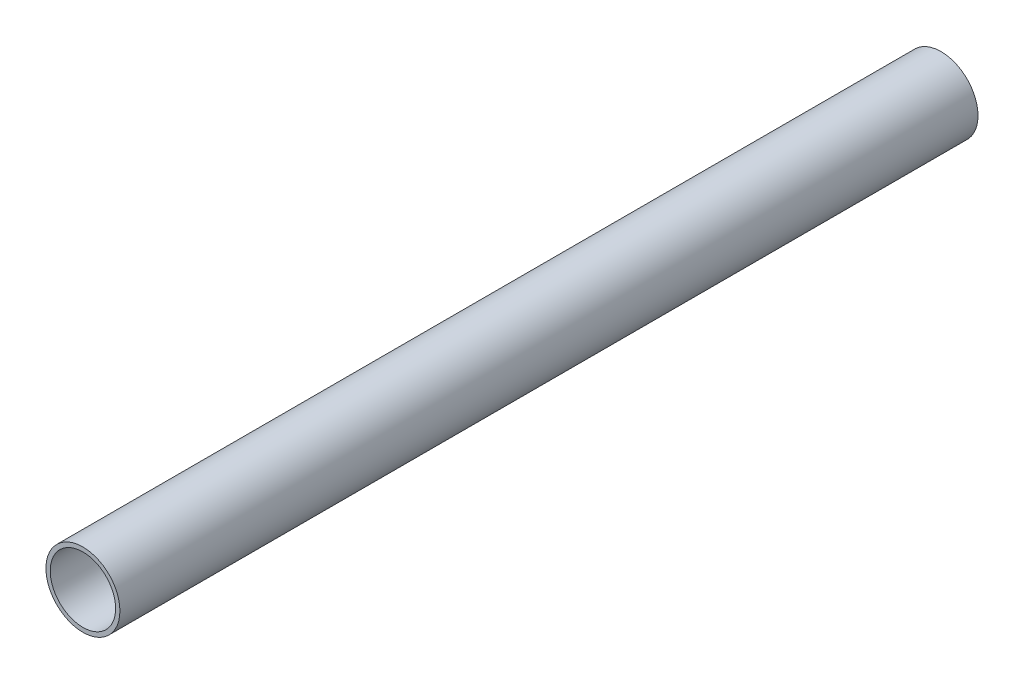
ISO-10303-21;
HEADER;
FILE_DESCRIPTION(('STEP AP214'),'2;1');
FILE_NAME('part.step','',(''),(''),'','','');
FILE_SCHEMA(('AUTOMOTIVE_DESIGN { 1 0 10303 214 1 1 1 1 }'));
ENDSEC;
DATA;
#1=APPLICATION_CONTEXT('core data for automotive mechanical design processes');
#2=APPLICATION_PROTOCOL_DEFINITION('international standard','automotive_design',2000,#1);
#3=PRODUCT_CONTEXT('',#1,'mechanical');
#4=PRODUCT('Part','Part','',(#3));
#5=PRODUCT_RELATED_PRODUCT_CATEGORY('part','',(#4));
#6=PRODUCT_DEFINITION_FORMATION('','',#4);
#7=PRODUCT_DEFINITION_CONTEXT('part definition',#1,'design');
#8=PRODUCT_DEFINITION('design','',#6,#7);
#9=PRODUCT_DEFINITION_SHAPE('','',#8);
#10=(LENGTH_UNIT() NAMED_UNIT(*) SI_UNIT(.MILLI.,.METRE.));
#11=(NAMED_UNIT(*) PLANE_ANGLE_UNIT() SI_UNIT($,.RADIAN.));
#12=(NAMED_UNIT(*) SI_UNIT($,.STERADIAN.) SOLID_ANGLE_UNIT());
#13=UNCERTAINTY_MEASURE_WITH_UNIT(LENGTH_MEASURE(1.E-05),#10,'distance_accuracy_value','');
#14=(GEOMETRIC_REPRESENTATION_CONTEXT(3) GLOBAL_UNCERTAINTY_ASSIGNED_CONTEXT((#13)) GLOBAL_UNIT_ASSIGNED_CONTEXT((#10,
#11,#12)) REPRESENTATION_CONTEXT('',''));
#15=CARTESIAN_POINT('',(0.,0.,0.));
#16=DIRECTION('',(0.,0.,1.));
#17=DIRECTION('',(1.,0.,0.));
#18=AXIS2_PLACEMENT_3D('',#15,#16,#17);
#19=CARTESIAN_POINT('',(0.,0.,-2000.));
#20=DIRECTION('',(0.,0.,1.));
#21=DIRECTION('',(1.,0.,0.));
#22=AXIS2_PLACEMENT_3D('',#19,#20,#21);
#23=CYLINDRICAL_SURFACE('',#22,86.2);
#24=CARTESIAN_POINT('',(0.,0.,-2000.));
#25=DIRECTION('',(0.,0.,1.));
#26=DIRECTION('',(1.,0.,0.));
#27=AXIS2_PLACEMENT_3D('',#24,#25,#26);
#28=CIRCLE('',#27,86.2);
#29=CARTESIAN_POINT('',(86.2,0.,-2000.));
#30=VERTEX_POINT('',#29);
#31=EDGE_CURVE('E10',#30,#30,#28,.T.);
#32=ORIENTED_EDGE('',*,*,#31,.T.);
#33=EDGE_LOOP('',(#32));
#34=FACE_BOUND('',#33,.T.);
#35=CARTESIAN_POINT('',(0.,0.,0.));
#36=DIRECTION('',(0.,0.,1.));
#37=DIRECTION('',(1.,0.,0.));
#38=AXIS2_PLACEMENT_3D('',#35,#36,#37);
#39=CIRCLE('',#38,86.2);
#40=CARTESIAN_POINT('',(86.2,0.,0.));
#41=VERTEX_POINT('',#40);
#42=EDGE_CURVE('E34',#41,#41,#39,.T.);
#43=ORIENTED_EDGE('',*,*,#42,.F.);
#44=EDGE_LOOP('',(#43));
#45=FACE_BOUND('',#44,.T.);
#46=ADVANCED_FACE('F31',(#34,#45),#23,.T.);
#47=CARTESIAN_POINT('',(0.,0.,-2000.));
#48=DIRECTION('',(0.,0.,1.));
#49=DIRECTION('',(1.,0.,0.));
#50=AXIS2_PLACEMENT_3D('',#47,#48,#49);
#51=PLANE('',#50);
#52=CARTESIAN_POINT('',(0.,0.,-2000.));
#53=DIRECTION('',(0.,0.,1.));
#54=DIRECTION('',(1.,0.,0.));
#55=AXIS2_PLACEMENT_3D('',#52,#53,#54);
#56=CIRCLE('',#55,76.2);
#57=CARTESIAN_POINT('',(76.2,0.,-2000.));
#58=VERTEX_POINT('',#57);
#59=EDGE_CURVE('E41',#58,#58,#56,.T.);
#60=ORIENTED_EDGE('',*,*,#59,.T.);
#61=EDGE_LOOP('',(#60));
#62=FACE_BOUND('',#61,.T.);
#63=ORIENTED_EDGE('',*,*,#31,.F.);
#64=EDGE_LOOP('',(#63));
#65=FACE_BOUND('',#64,.T.);
#66=ADVANCED_FACE('F49',(#62,#65),#51,.F.);
#67=CARTESIAN_POINT('',(0.,0.,0.));
#68=DIRECTION('',(0.,0.,1.));
#69=DIRECTION('',(1.,0.,0.));
#70=AXIS2_PLACEMENT_3D('',#67,#68,#69);
#71=PLANE('',#70);
#72=CARTESIAN_POINT('',(0.,0.,0.));
#73=DIRECTION('',(0.,0.,1.));
#74=DIRECTION('',(1.,0.,0.));
#75=AXIS2_PLACEMENT_3D('',#72,#73,#74);
#76=CIRCLE('',#75,76.2);
#77=CARTESIAN_POINT('',(76.2,0.,0.));
#78=VERTEX_POINT('',#77);
#79=EDGE_CURVE('E43',#78,#78,#76,.T.);
#80=ORIENTED_EDGE('',*,*,#79,.F.);
#81=EDGE_LOOP('',(#80));
#82=FACE_BOUND('',#81,.T.);
#83=ORIENTED_EDGE('',*,*,#42,.T.);
#84=EDGE_LOOP('',(#83));
#85=FACE_BOUND('',#84,.T.);
#86=ADVANCED_FACE('F55',(#82,#85),#71,.T.);
#87=CARTESIAN_POINT('',(0.,0.,-2000.));
#88=DIRECTION('',(0.,0.,1.));
#89=DIRECTION('',(1.,0.,0.));
#90=AXIS2_PLACEMENT_3D('',#87,#88,#89);
#91=CYLINDRICAL_SURFACE('',#90,76.2);
#92=ORIENTED_EDGE('',*,*,#59,.F.);
#93=EDGE_LOOP('',(#92));
#94=FACE_BOUND('',#93,.T.);
#95=ORIENTED_EDGE('',*,*,#79,.T.);
#96=EDGE_LOOP('',(#95));
#97=FACE_BOUND('',#96,.T.);
#98=ADVANCED_FACE('F52',(#94,#97),#91,.F.);
#99=CLOSED_SHELL('',(#46,#66,#86,#98));
#100=MANIFOLD_SOLID_BREP('B2',#99);
#101=ADVANCED_BREP_SHAPE_REPRESENTATION('',(#18,#100),#14);
#102=SHAPE_DEFINITION_REPRESENTATION(#9,#101);
ENDSEC;
END-ISO-10303-21;
